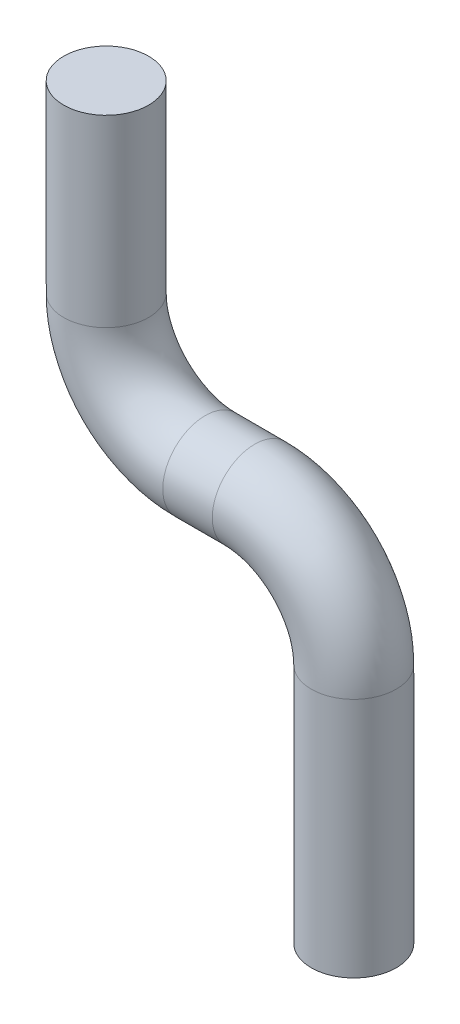
ISO-10303-21;
HEADER;
FILE_DESCRIPTION(('STEP AP214'),'2;1');
FILE_NAME('part.step','',(''),(''),'','','');
FILE_SCHEMA(('AUTOMOTIVE_DESIGN { 1 0 10303 214 1 1 1 1 }'));
ENDSEC;
DATA;
#1=APPLICATION_CONTEXT('core data for automotive mechanical design processes');
#2=APPLICATION_PROTOCOL_DEFINITION('international standard','automotive_design',2000,#1);
#3=PRODUCT_CONTEXT('',#1,'mechanical');
#4=PRODUCT('Part','Part','',(#3));
#5=PRODUCT_RELATED_PRODUCT_CATEGORY('part','',(#4));
#6=PRODUCT_DEFINITION_FORMATION('','',#4);
#7=PRODUCT_DEFINITION_CONTEXT('part definition',#1,'design');
#8=PRODUCT_DEFINITION('design','',#6,#7);
#9=PRODUCT_DEFINITION_SHAPE('','',#8);
#10=(LENGTH_UNIT() NAMED_UNIT(*) SI_UNIT(.MILLI.,.METRE.));
#11=(NAMED_UNIT(*) PLANE_ANGLE_UNIT() SI_UNIT($,.RADIAN.));
#12=(NAMED_UNIT(*) SI_UNIT($,.STERADIAN.) SOLID_ANGLE_UNIT());
#13=UNCERTAINTY_MEASURE_WITH_UNIT(LENGTH_MEASURE(1.E-05),#10,'distance_accuracy_value','');
#14=(GEOMETRIC_REPRESENTATION_CONTEXT(3) GLOBAL_UNCERTAINTY_ASSIGNED_CONTEXT((#13)) GLOBAL_UNIT_ASSIGNED_CONTEXT((#10,
#11,#12)) REPRESENTATION_CONTEXT('',''));
#15=CARTESIAN_POINT('',(0.,0.,0.));
#16=DIRECTION('',(0.,0.,1.));
#17=DIRECTION('',(1.,0.,0.));
#18=AXIS2_PLACEMENT_3D('',#15,#16,#17);
#19=CARTESIAN_POINT('',(-6.,0.,0.));
#20=DIRECTION('',(0.,1.,0.));
#21=DIRECTION('',(0.,0.,1.));
#22=AXIS2_PLACEMENT_3D('',#19,#20,#21);
#23=PLANE('',#22);
#24=CARTESIAN_POINT('',(-6.,0.,0.));
#25=DIRECTION('',(0.,1.,0.));
#26=DIRECTION('',(0.,0.,1.));
#27=AXIS2_PLACEMENT_3D('',#24,#25,#26);
#28=CIRCLE('',#27,6.);
#29=CARTESIAN_POINT('',(-6.,0.,6.));
#30=VERTEX_POINT('',#29);
#31=EDGE_CURVE('E63',#30,#30,#28,.T.);
#32=ORIENTED_EDGE('',*,*,#31,.F.);
#33=EDGE_LOOP('',(#32));
#34=FACE_BOUND('',#33,.T.);
#35=ADVANCED_FACE('F34',(#34),#23,.F.);
#36=CARTESIAN_POINT('',(-41.,88.11320754717,0.));
#37=DIRECTION('',(0.,1.,0.));
#38=DIRECTION('',(0.,0.,1.));
#39=AXIS2_PLACEMENT_3D('',#36,#37,#38);
#40=PLANE('',#39);
#41=CARTESIAN_POINT('',(-41.,88.11320754717,0.));
#42=DIRECTION('',(0.,1.,0.));
#43=DIRECTION('',(0.,0.,1.));
#44=AXIS2_PLACEMENT_3D('',#41,#42,#43);
#45=CIRCLE('',#44,6.);
#46=CARTESIAN_POINT('',(-41.,88.11320754717,6.));
#47=VERTEX_POINT('',#46);
#48=EDGE_CURVE('E10',#47,#47,#45,.T.);
#49=ORIENTED_EDGE('',*,*,#48,.T.);
#50=EDGE_LOOP('',(#49));
#51=FACE_BOUND('',#50,.T.);
#52=ADVANCED_FACE('F72',(#51),#40,.T.);
#53=CARTESIAN_POINT('',(-6.,0.,0.));
#54=DIRECTION('',(0.,1.,0.));
#55=DIRECTION('',(0.,0.,1.));
#56=AXIS2_PLACEMENT_3D('',#53,#54,#55);
#57=CYLINDRICAL_SURFACE('',#56,6.);
#58=CARTESIAN_POINT('',(-6.,34.1132075471697,0.));
#59=DIRECTION('',(0.,1.,0.));
#60=DIRECTION('',(0.,0.,1.));
#61=AXIS2_PLACEMENT_3D('',#58,#59,#60);
#62=CIRCLE('',#61,6.);
#63=CARTESIAN_POINT('',(0.,34.1132075471697,0.));
#64=VERTEX_POINT('',#63);
#65=EDGE_CURVE('E59',#64,#64,#62,.T.);
#66=ORIENTED_EDGE('',*,*,#65,.F.);
#67=EDGE_LOOP('',(#66));
#68=FACE_BOUND('',#67,.T.);
#69=ORIENTED_EDGE('',*,*,#31,.T.);
#70=EDGE_LOOP('',(#69));
#71=FACE_BOUND('',#70,.T.);
#72=ADVANCED_FACE('F69',(#68,#71),#57,.T.);
#73=CARTESIAN_POINT('',(-20.,34.1132075471697,0.));
#74=DIRECTION('',(0.,0.,1.));
#75=DIRECTION('',(1.,0.,0.));
#76=AXIS2_PLACEMENT_3D('',#73,#74,#75);
#77=TOROIDAL_SURFACE('',#76,14.,6.);
#78=CARTESIAN_POINT('',(-20.0000000000001,48.11320754717,0.));
#79=DIRECTION('',(-1.,0.,0.));
#80=DIRECTION('',(0.,0.,1.));
#81=AXIS2_PLACEMENT_3D('',#78,#79,#80);
#82=CIRCLE('',#81,6.);
#83=CARTESIAN_POINT('',(-20.0000000000001,54.1132075471697,0.));
#84=VERTEX_POINT('',#83);
#85=EDGE_CURVE('E53',#84,#84,#82,.T.);
#86=CARTESIAN_POINT('',(-20.,34.1132075471697,0.));
#87=DIRECTION('',(0.,0.,1.));
#88=DIRECTION('',(1.,0.,0.));
#89=AXIS2_PLACEMENT_3D('',#86,#87,#88);
#90=CIRCLE('',#89,20.);
#91=EDGE_CURVE('',#64,#84,#90,.T.);
#92=ORIENTED_EDGE('',*,*,#65,.T.);
#93=ORIENTED_EDGE('',*,*,#85,.F.);
#94=ORIENTED_EDGE('',*,*,#91,.T.);
#95=ORIENTED_EDGE('',*,*,#91,.F.);
#96=EDGE_LOOP('',(#92,#94,#93,#95));
#97=FACE_BOUND('',#96,.T.);
#98=ADVANCED_FACE('F90',(#97),#77,.T.);
#99=CARTESIAN_POINT('',(-20.0000000000001,48.11320754717,0.));
#100=DIRECTION('',(-1.,0.,0.));
#101=DIRECTION('',(0.,-1.,0.));
#102=AXIS2_PLACEMENT_3D('',#99,#100,#101);
#103=CYLINDRICAL_SURFACE('',#102,6.);
#104=CARTESIAN_POINT('',(-27.,48.11320754717,0.));
#105=DIRECTION('',(-1.,0.,0.));
#106=DIRECTION('',(0.,0.,1.));
#107=AXIS2_PLACEMENT_3D('',#104,#105,#106);
#108=CIRCLE('',#107,6.);
#109=CARTESIAN_POINT('',(-27.,42.1132075471698,0.));
#110=VERTEX_POINT('',#109);
#111=EDGE_CURVE('E47',#110,#110,#108,.T.);
#112=ORIENTED_EDGE('',*,*,#111,.F.);
#113=EDGE_LOOP('',(#112));
#114=FACE_BOUND('',#113,.T.);
#115=ORIENTED_EDGE('',*,*,#85,.T.);
#116=EDGE_LOOP('',(#115));
#117=FACE_BOUND('',#116,.T.);
#118=ADVANCED_FACE('F84',(#114,#117),#103,.T.);
#119=CARTESIAN_POINT('',(-27.,62.1132075471698,0.));
#120=DIRECTION('',(0.,0.,-1.));
#121=DIRECTION('',(-1.,0.,0.));
#122=AXIS2_PLACEMENT_3D('',#119,#120,#121);
#123=TOROIDAL_SURFACE('',#122,14.,6.);
#124=CARTESIAN_POINT('',(-41.,62.1132075471698,0.));
#125=DIRECTION('',(0.,1.,0.));
#126=DIRECTION('',(0.,0.,1.));
#127=AXIS2_PLACEMENT_3D('',#124,#125,#126);
#128=CIRCLE('',#127,6.);
#129=CARTESIAN_POINT('',(-47.,62.1132075471698,0.));
#130=VERTEX_POINT('',#129);
#131=EDGE_CURVE('E41',#130,#130,#128,.T.);
#132=CARTESIAN_POINT('',(-27.,62.1132075471698,0.));
#133=DIRECTION('',(0.,0.,-1.));
#134=DIRECTION('',(-1.,0.,0.));
#135=AXIS2_PLACEMENT_3D('',#132,#133,#134);
#136=CIRCLE('',#135,20.);
#137=EDGE_CURVE('',#110,#130,#136,.T.);
#138=ORIENTED_EDGE('',*,*,#111,.T.);
#139=ORIENTED_EDGE('',*,*,#131,.F.);
#140=ORIENTED_EDGE('',*,*,#137,.T.);
#141=ORIENTED_EDGE('',*,*,#137,.F.);
#142=EDGE_LOOP('',(#138,#140,#139,#141));
#143=FACE_BOUND('',#142,.T.);
#144=ADVANCED_FACE('F78',(#143),#123,.T.);
#145=CARTESIAN_POINT('',(-41.,62.1132075471698,0.));
#146=DIRECTION('',(0.,1.,0.));
#147=DIRECTION('',(0.,0.,1.));
#148=AXIS2_PLACEMENT_3D('',#145,#146,#147);
#149=CYLINDRICAL_SURFACE('',#148,6.);
#150=ORIENTED_EDGE('',*,*,#48,.F.);
#151=EDGE_LOOP('',(#150));
#152=FACE_BOUND('',#151,.T.);
#153=ORIENTED_EDGE('',*,*,#131,.T.);
#154=EDGE_LOOP('',(#153));
#155=FACE_BOUND('',#154,.T.);
#156=ADVANCED_FACE('F76',(#152,#155),#149,.T.);
#157=CLOSED_SHELL('',(#35,#52,#72,#98,#118,#144,#156));
#158=MANIFOLD_SOLID_BREP('B2',#157);
#159=ADVANCED_BREP_SHAPE_REPRESENTATION('',(#18,#158),#14);
#160=SHAPE_DEFINITION_REPRESENTATION(#9,#159);
ENDSEC;
END-ISO-10303-21;
